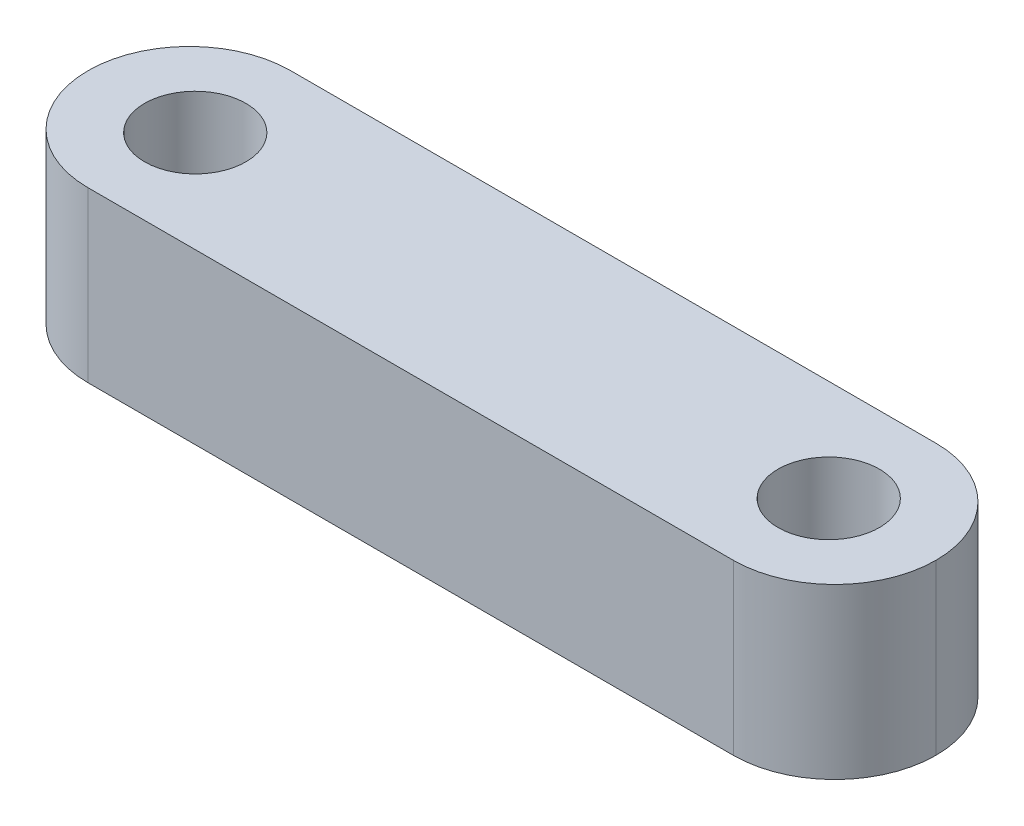
ISO-10303-21;
HEADER;
FILE_DESCRIPTION(('STEP AP214'),'2;1');
FILE_NAME('part.step','',(''),(''),'','','');
FILE_SCHEMA(('AUTOMOTIVE_DESIGN { 1 0 10303 214 1 1 1 1 }'));
ENDSEC;
DATA;
#1=APPLICATION_CONTEXT('core data for automotive mechanical design processes');
#2=APPLICATION_PROTOCOL_DEFINITION('international standard','automotive_design',2000,#1);
#3=PRODUCT_CONTEXT('',#1,'mechanical');
#4=PRODUCT('Part','Part','',(#3));
#5=PRODUCT_RELATED_PRODUCT_CATEGORY('part','',(#4));
#6=PRODUCT_DEFINITION_FORMATION('','',#4);
#7=PRODUCT_DEFINITION_CONTEXT('part definition',#1,'design');
#8=PRODUCT_DEFINITION('design','',#6,#7);
#9=PRODUCT_DEFINITION_SHAPE('','',#8);
#10=(LENGTH_UNIT() NAMED_UNIT(*) SI_UNIT(.MILLI.,.METRE.));
#11=(NAMED_UNIT(*) PLANE_ANGLE_UNIT() SI_UNIT($,.RADIAN.));
#12=(NAMED_UNIT(*) SI_UNIT($,.STERADIAN.) SOLID_ANGLE_UNIT());
#13=UNCERTAINTY_MEASURE_WITH_UNIT(LENGTH_MEASURE(1.E-05),#10,'distance_accuracy_value','');
#14=(GEOMETRIC_REPRESENTATION_CONTEXT(3) GLOBAL_UNCERTAINTY_ASSIGNED_CONTEXT((#13)) GLOBAL_UNIT_ASSIGNED_CONTEXT((#10,
#11,#12)) REPRESENTATION_CONTEXT('',''));
#15=CARTESIAN_POINT('',(0.,0.,0.));
#16=DIRECTION('',(0.,0.,1.));
#17=DIRECTION('',(1.,0.,0.));
#18=AXIS2_PLACEMENT_3D('',#15,#16,#17);
#19=CARTESIAN_POINT('',(0.,10.,0.));
#20=DIRECTION('',(0.,-1.,0.));
#21=DIRECTION('',(0.,0.,-1.));
#22=AXIS2_PLACEMENT_3D('',#19,#20,#21);
#23=PLANE('',#22);
#24=CARTESIAN_POINT('',(19.1,10.,0.));
#25=DIRECTION('',(0.,-1.,0.));
#26=DIRECTION('',(0.,0.,-1.));
#27=AXIS2_PLACEMENT_3D('',#24,#25,#26);
#28=CIRCLE('',#27,6.);
#29=CARTESIAN_POINT('',(19.1,10.,6.));
#30=VERTEX_POINT('',#29);
#31=CARTESIAN_POINT('',(25.1,10.,0.));
#32=VERTEX_POINT('',#31);
#33=EDGE_CURVE('E93',#30,#32,#28,.F.);
#34=ORIENTED_EDGE('',*,*,#33,.T.);
#35=CARTESIAN_POINT('',(19.1,10.,0.));
#36=DIRECTION('',(0.,-1.,0.));
#37=DIRECTION('',(0.,0.,-1.));
#38=AXIS2_PLACEMENT_3D('',#35,#36,#37);
#39=CIRCLE('',#38,6.);
#40=CARTESIAN_POINT('',(19.1,10.,-6.));
#41=VERTEX_POINT('',#40);
#42=EDGE_CURVE('E185',#32,#41,#39,.F.);
#43=ORIENTED_EDGE('',*,*,#42,.T.);
#44=DIRECTION('',(1.,0.,0.));
#45=VECTOR('',#44,1.);
#46=CARTESIAN_POINT('',(-25.1,10.,-6.));
#47=LINE('',#46,#45);
#48=CARTESIAN_POINT('',(-19.1,10.,-6.));
#49=VERTEX_POINT('',#48);
#50=EDGE_CURVE('E167',#49,#41,#47,.T.);
#51=ORIENTED_EDGE('',*,*,#50,.F.);
#52=CARTESIAN_POINT('',(-19.1,10.,0.));
#53=DIRECTION('',(0.,-1.,0.));
#54=DIRECTION('',(0.,0.,-1.));
#55=AXIS2_PLACEMENT_3D('',#52,#53,#54);
#56=CIRCLE('',#55,6.);
#57=CARTESIAN_POINT('',(-25.1,10.,0.));
#58=VERTEX_POINT('',#57);
#59=EDGE_CURVE('E160',#49,#58,#56,.F.);
#60=ORIENTED_EDGE('',*,*,#59,.T.);
#61=CARTESIAN_POINT('',(-19.1,10.,0.));
#62=DIRECTION('',(0.,-1.,0.));
#63=DIRECTION('',(0.,0.,-1.));
#64=AXIS2_PLACEMENT_3D('',#61,#62,#63);
#65=CIRCLE('',#64,6.);
#66=CARTESIAN_POINT('',(-19.1,10.,6.));
#67=VERTEX_POINT('',#66);
#68=EDGE_CURVE('E178',#58,#67,#65,.F.);
#69=ORIENTED_EDGE('',*,*,#68,.T.);
#70=DIRECTION('',(1.,0.,0.));
#71=VECTOR('',#70,1.);
#72=CARTESIAN_POINT('',(-25.1,10.,6.));
#73=LINE('',#72,#71);
#74=EDGE_CURVE('E162',#67,#30,#73,.T.);
#75=ORIENTED_EDGE('',*,*,#74,.T.);
#76=EDGE_LOOP('',(#34,#43,#51,#60,#69,#75));
#77=FACE_BOUND('',#76,.T.);
#78=CARTESIAN_POINT('',(-18.75,10.,0.));
#79=DIRECTION('',(0.,1.,0.));
#80=DIRECTION('',(0.,0.,1.));
#81=AXIS2_PLACEMENT_3D('',#78,#79,#80);
#82=CIRCLE('',#81,3.);
#83=CARTESIAN_POINT('',(-18.75,10.,3.));
#84=VERTEX_POINT('',#83);
#85=EDGE_CURVE('E157',#84,#84,#82,.T.);
#86=ORIENTED_EDGE('',*,*,#85,.F.);
#87=EDGE_LOOP('',(#86));
#88=FACE_BOUND('',#87,.T.);
#89=CARTESIAN_POINT('',(18.75,10.,0.));
#90=DIRECTION('',(0.,1.,0.));
#91=DIRECTION('',(0.,0.,1.));
#92=AXIS2_PLACEMENT_3D('',#89,#90,#91);
#93=CIRCLE('',#92,3.);
#94=CARTESIAN_POINT('',(18.75,10.,3.));
#95=VERTEX_POINT('',#94);
#96=EDGE_CURVE('E198',#95,#95,#93,.T.);
#97=ORIENTED_EDGE('',*,*,#96,.F.);
#98=EDGE_LOOP('',(#97));
#99=FACE_BOUND('',#98,.T.);
#100=ADVANCED_FACE('F75',(#77,#88,#99),#23,.F.);
#101=CARTESIAN_POINT('',(0.,0.,0.));
#102=DIRECTION('',(0.,-1.,0.));
#103=DIRECTION('',(0.,0.,-1.));
#104=AXIS2_PLACEMENT_3D('',#101,#102,#103);
#105=PLANE('',#104);
#106=CARTESIAN_POINT('',(-18.75,0.,0.));
#107=DIRECTION('',(0.,1.,0.));
#108=DIRECTION('',(0.,0.,1.));
#109=AXIS2_PLACEMENT_3D('',#106,#107,#108);
#110=CIRCLE('',#109,3.);
#111=CARTESIAN_POINT('',(-18.75,0.,3.));
#112=VERTEX_POINT('',#111);
#113=EDGE_CURVE('E210',#112,#112,#110,.T.);
#114=ORIENTED_EDGE('',*,*,#113,.T.);
#115=EDGE_LOOP('',(#114));
#116=FACE_BOUND('',#115,.T.);
#117=DIRECTION('',(1.,0.,0.));
#118=VECTOR('',#117,1.);
#119=CARTESIAN_POINT('',(-25.1,0.,-6.));
#120=LINE('',#119,#118);
#121=CARTESIAN_POINT('',(-19.1,0.,-6.));
#122=VERTEX_POINT('',#121);
#123=CARTESIAN_POINT('',(19.1,0.,-6.));
#124=VERTEX_POINT('',#123);
#125=EDGE_CURVE('E135',#122,#124,#120,.T.);
#126=ORIENTED_EDGE('',*,*,#125,.T.);
#127=CARTESIAN_POINT('',(19.1,0.,0.));
#128=DIRECTION('',(0.,-1.,0.));
#129=DIRECTION('',(0.,0.,-1.));
#130=AXIS2_PLACEMENT_3D('',#127,#128,#129);
#131=CIRCLE('',#130,6.);
#132=CARTESIAN_POINT('',(25.1,0.,0.));
#133=VERTEX_POINT('',#132);
#134=EDGE_CURVE('E175',#124,#133,#131,.T.);
#135=ORIENTED_EDGE('',*,*,#134,.T.);
#136=CARTESIAN_POINT('',(19.1,0.,0.));
#137=DIRECTION('',(0.,-1.,0.));
#138=DIRECTION('',(0.,0.,-1.));
#139=AXIS2_PLACEMENT_3D('',#136,#137,#138);
#140=CIRCLE('',#139,6.);
#141=CARTESIAN_POINT('',(19.1,0.,6.));
#142=VERTEX_POINT('',#141);
#143=EDGE_CURVE('E144',#133,#142,#140,.T.);
#144=ORIENTED_EDGE('',*,*,#143,.T.);
#145=DIRECTION('',(1.,0.,0.));
#146=VECTOR('',#145,1.);
#147=CARTESIAN_POINT('',(-25.1,0.,6.));
#148=LINE('',#147,#146);
#149=CARTESIAN_POINT('',(-19.1,0.,6.));
#150=VERTEX_POINT('',#149);
#151=EDGE_CURVE('E156',#150,#142,#148,.T.);
#152=ORIENTED_EDGE('',*,*,#151,.F.);
#153=CARTESIAN_POINT('',(-19.1,0.,0.));
#154=DIRECTION('',(0.,-1.,0.));
#155=DIRECTION('',(0.,0.,-1.));
#156=AXIS2_PLACEMENT_3D('',#153,#154,#155);
#157=CIRCLE('',#156,6.);
#158=CARTESIAN_POINT('',(-25.1,0.,0.));
#159=VERTEX_POINT('',#158);
#160=EDGE_CURVE('E138',#150,#159,#157,.T.);
#161=ORIENTED_EDGE('',*,*,#160,.T.);
#162=CARTESIAN_POINT('',(-19.1,0.,0.));
#163=DIRECTION('',(0.,-1.,0.));
#164=DIRECTION('',(0.,0.,-1.));
#165=AXIS2_PLACEMENT_3D('',#162,#163,#164);
#166=CIRCLE('',#165,6.);
#167=EDGE_CURVE('E131',#159,#122,#166,.T.);
#168=ORIENTED_EDGE('',*,*,#167,.T.);
#169=EDGE_LOOP('',(#126,#135,#144,#152,#161,#168));
#170=FACE_BOUND('',#169,.T.);
#171=CARTESIAN_POINT('',(18.75,0.,0.));
#172=DIRECTION('',(0.,1.,0.));
#173=DIRECTION('',(0.,0.,1.));
#174=AXIS2_PLACEMENT_3D('',#171,#172,#173);
#175=CIRCLE('',#174,3.);
#176=CARTESIAN_POINT('',(18.75,0.,3.));
#177=VERTEX_POINT('',#176);
#178=EDGE_CURVE('E192',#177,#177,#175,.T.);
#179=ORIENTED_EDGE('',*,*,#178,.T.);
#180=EDGE_LOOP('',(#179));
#181=FACE_BOUND('',#180,.T.);
#182=ADVANCED_FACE('F133',(#116,#170,#181),#105,.T.);
#183=CARTESIAN_POINT('',(-25.1,10.,6.));
#184=DIRECTION('',(0.,0.,-1.));
#185=DIRECTION('',(-1.,0.,0.));
#186=AXIS2_PLACEMENT_3D('',#183,#184,#185);
#187=PLANE('',#186);
#188=ORIENTED_EDGE('',*,*,#151,.T.);
#189=DIRECTION('',(0.,-1.,0.));
#190=VECTOR('',#189,1.);
#191=CARTESIAN_POINT('',(19.1,10.,6.));
#192=LINE('',#191,#190);
#193=EDGE_CURVE('E12',#142,#30,#192,.F.);
#194=ORIENTED_EDGE('',*,*,#193,.T.);
#195=ORIENTED_EDGE('',*,*,#74,.F.);
#196=DIRECTION('',(0.,-1.,0.));
#197=VECTOR('',#196,1.);
#198=CARTESIAN_POINT('',(-19.1,0.,6.));
#199=LINE('',#198,#197);
#200=EDGE_CURVE('E85',#67,#150,#199,.T.);
#201=ORIENTED_EDGE('',*,*,#200,.T.);
#202=EDGE_LOOP('',(#188,#194,#195,#201));
#203=FACE_BOUND('',#202,.T.);
#204=ADVANCED_FACE('F204',(#203),#187,.F.);
#205=CARTESIAN_POINT('',(-25.1,10.,-6.));
#206=DIRECTION('',(0.,0.,-1.));
#207=DIRECTION('',(-1.,0.,0.));
#208=AXIS2_PLACEMENT_3D('',#205,#206,#207);
#209=PLANE('',#208);
#210=ORIENTED_EDGE('',*,*,#50,.T.);
#211=DIRECTION('',(0.,-1.,0.));
#212=VECTOR('',#211,1.);
#213=CARTESIAN_POINT('',(19.1,0.,-6.));
#214=LINE('',#213,#212);
#215=EDGE_CURVE('E154',#41,#124,#214,.T.);
#216=ORIENTED_EDGE('',*,*,#215,.T.);
#217=ORIENTED_EDGE('',*,*,#125,.F.);
#218=DIRECTION('',(0.,-1.,0.));
#219=VECTOR('',#218,1.);
#220=CARTESIAN_POINT('',(-19.1,10.,-6.));
#221=LINE('',#220,#219);
#222=EDGE_CURVE('E151',#122,#49,#221,.F.);
#223=ORIENTED_EDGE('',*,*,#222,.T.);
#224=EDGE_LOOP('',(#210,#216,#217,#223));
#225=FACE_BOUND('',#224,.T.);
#226=ADVANCED_FACE('F150',(#225),#209,.T.);
#227=CARTESIAN_POINT('',(-18.75,10.,0.));
#228=DIRECTION('',(0.,-1.,0.));
#229=DIRECTION('',(0.,0.,-1.));
#230=AXIS2_PLACEMENT_3D('',#227,#228,#229);
#231=CYLINDRICAL_SURFACE('',#230,3.);
#232=ORIENTED_EDGE('',*,*,#85,.T.);
#233=EDGE_LOOP('',(#232));
#234=FACE_BOUND('',#233,.T.);
#235=ORIENTED_EDGE('',*,*,#113,.F.);
#236=EDGE_LOOP('',(#235));
#237=FACE_BOUND('',#236,.T.);
#238=ADVANCED_FACE('F233',(#234,#237),#231,.F.);
#239=CARTESIAN_POINT('',(18.75,10.,0.));
#240=DIRECTION('',(0.,-1.,0.));
#241=DIRECTION('',(0.,0.,-1.));
#242=AXIS2_PLACEMENT_3D('',#239,#240,#241);
#243=CYLINDRICAL_SURFACE('',#242,3.);
#244=ORIENTED_EDGE('',*,*,#96,.T.);
#245=EDGE_LOOP('',(#244));
#246=FACE_BOUND('',#245,.T.);
#247=ORIENTED_EDGE('',*,*,#178,.F.);
#248=EDGE_LOOP('',(#247));
#249=FACE_BOUND('',#248,.T.);
#250=ADVANCED_FACE('F221',(#246,#249),#243,.F.);
#251=CARTESIAN_POINT('',(19.1,10.,0.));
#252=DIRECTION('',(0.,-1.,0.));
#253=DIRECTION('',(0.,0.,-1.));
#254=AXIS2_PLACEMENT_3D('',#251,#252,#253);
#255=CYLINDRICAL_SURFACE('',#254,6.);
#256=DIRECTION('',(0.,-1.,0.));
#257=VECTOR('',#256,1.);
#258=CARTESIAN_POINT('',(25.1,10.,0.));
#259=LINE('',#258,#257);
#260=EDGE_CURVE('E189',#32,#133,#259,.T.);
#261=ORIENTED_EDGE('',*,*,#260,.F.);
#262=ORIENTED_EDGE('',*,*,#33,.F.);
#263=ORIENTED_EDGE('',*,*,#193,.F.);
#264=ORIENTED_EDGE('',*,*,#143,.F.);
#265=EDGE_LOOP('',(#261,#262,#263,#264));
#266=FACE_BOUND('',#265,.T.);
#267=ADVANCED_FACE('F243',(#266),#255,.T.);
#268=CARTESIAN_POINT('',(19.1,10.,0.));
#269=DIRECTION('',(0.,1.,0.));
#270=DIRECTION('',(0.,0.,1.));
#271=AXIS2_PLACEMENT_3D('',#268,#269,#270);
#272=CYLINDRICAL_SURFACE('',#271,6.);
#273=ORIENTED_EDGE('',*,*,#42,.F.);
#274=ORIENTED_EDGE('',*,*,#260,.T.);
#275=ORIENTED_EDGE('',*,*,#134,.F.);
#276=ORIENTED_EDGE('',*,*,#215,.F.);
#277=EDGE_LOOP('',(#273,#274,#275,#276));
#278=FACE_BOUND('',#277,.T.);
#279=ADVANCED_FACE('F240',(#278),#272,.T.);
#280=CARTESIAN_POINT('',(-19.1,10.,0.));
#281=DIRECTION('',(0.,1.,0.));
#282=DIRECTION('',(0.,0.,1.));
#283=AXIS2_PLACEMENT_3D('',#280,#281,#282);
#284=CYLINDRICAL_SURFACE('',#283,6.);
#285=ORIENTED_EDGE('',*,*,#200,.F.);
#286=ORIENTED_EDGE('',*,*,#68,.F.);
#287=DIRECTION('',(0.,-1.,0.));
#288=VECTOR('',#287,1.);
#289=CARTESIAN_POINT('',(-25.1,10.,0.));
#290=LINE('',#289,#288);
#291=EDGE_CURVE('E79',#159,#58,#290,.F.);
#292=ORIENTED_EDGE('',*,*,#291,.F.);
#293=ORIENTED_EDGE('',*,*,#160,.F.);
#294=EDGE_LOOP('',(#285,#286,#292,#293));
#295=FACE_BOUND('',#294,.T.);
#296=ADVANCED_FACE('F77',(#295),#284,.T.);
#297=CARTESIAN_POINT('',(-19.1,10.,0.));
#298=DIRECTION('',(0.,-1.,0.));
#299=DIRECTION('',(0.,0.,-1.));
#300=AXIS2_PLACEMENT_3D('',#297,#298,#299);
#301=CYLINDRICAL_SURFACE('',#300,6.);
#302=ORIENTED_EDGE('',*,*,#59,.F.);
#303=ORIENTED_EDGE('',*,*,#222,.F.);
#304=ORIENTED_EDGE('',*,*,#167,.F.);
#305=ORIENTED_EDGE('',*,*,#291,.T.);
#306=EDGE_LOOP('',(#302,#303,#304,#305));
#307=FACE_BOUND('',#306,.T.);
#308=ADVANCED_FACE('F159',(#307),#301,.T.);
#309=CLOSED_SHELL('',(#100,#182,#204,#226,#238,#250,#267,#279,#296,#308));
#310=MANIFOLD_SOLID_BREP('B2',#309);
#311=ADVANCED_BREP_SHAPE_REPRESENTATION('',(#18,#310),#14);
#312=SHAPE_DEFINITION_REPRESENTATION(#9,#311);
ENDSEC;
END-ISO-10303-21;
